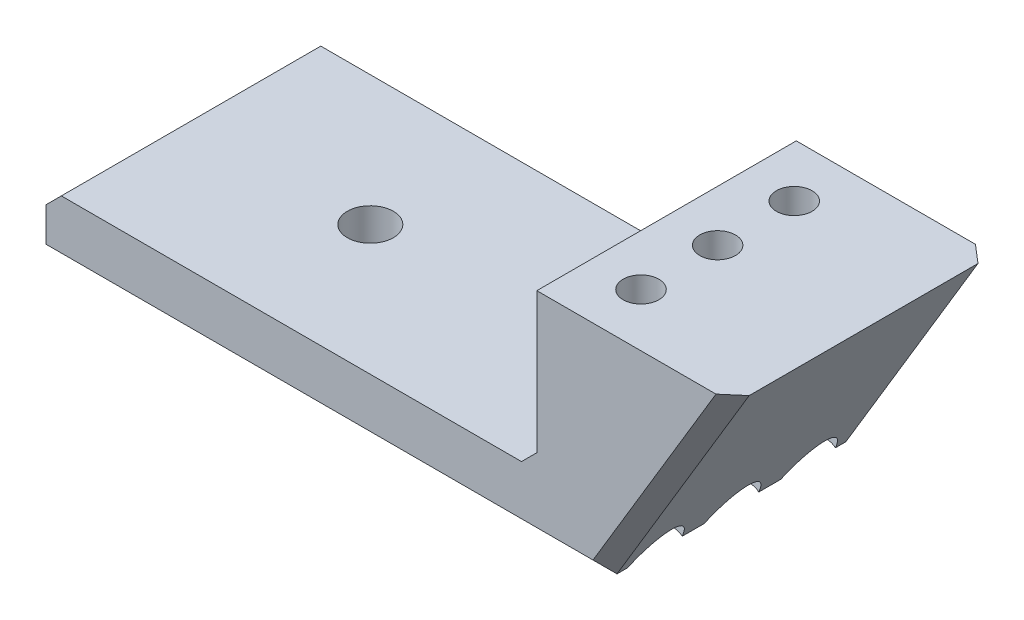
ISO-10303-21;
HEADER;
FILE_DESCRIPTION(('STEP AP214'),'2;1');
FILE_NAME('part.step','',(''),(''),'','','');
FILE_SCHEMA(('AUTOMOTIVE_DESIGN { 1 0 10303 214 1 1 1 1 }'));
ENDSEC;
DATA;
#1=APPLICATION_CONTEXT('core data for automotive mechanical design processes');
#2=APPLICATION_PROTOCOL_DEFINITION('international standard','automotive_design',2000,#1);
#3=PRODUCT_CONTEXT('',#1,'mechanical');
#4=PRODUCT('Part','Part','',(#3));
#5=PRODUCT_RELATED_PRODUCT_CATEGORY('part','',(#4));
#6=PRODUCT_DEFINITION_FORMATION('','',#4);
#7=PRODUCT_DEFINITION_CONTEXT('part definition',#1,'design');
#8=PRODUCT_DEFINITION('design','',#6,#7);
#9=PRODUCT_DEFINITION_SHAPE('','',#8);
#10=(LENGTH_UNIT() NAMED_UNIT(*) SI_UNIT(.MILLI.,.METRE.));
#11=(NAMED_UNIT(*) PLANE_ANGLE_UNIT() SI_UNIT($,.RADIAN.));
#12=(NAMED_UNIT(*) SI_UNIT($,.STERADIAN.) SOLID_ANGLE_UNIT());
#13=UNCERTAINTY_MEASURE_WITH_UNIT(LENGTH_MEASURE(1.E-05),#10,'distance_accuracy_value','');
#14=(GEOMETRIC_REPRESENTATION_CONTEXT(3) GLOBAL_UNCERTAINTY_ASSIGNED_CONTEXT((#13)) GLOBAL_UNIT_ASSIGNED_CONTEXT((#10,
#11,#12)) REPRESENTATION_CONTEXT('',''));
#15=CARTESIAN_POINT('',(0.,0.,0.));
#16=DIRECTION('',(0.,0.,1.));
#17=DIRECTION('',(1.,0.,0.));
#18=AXIS2_PLACEMENT_3D('',#15,#16,#17);
#19=CARTESIAN_POINT('',(5.00000000000001,-21.59,5.2));
#20=DIRECTION('',(0.,-1.,0.));
#21=DIRECTION('',(0.,0.,-1.));
#22=AXIS2_PLACEMENT_3D('',#19,#20,#21);
#23=CYLINDRICAL_SURFACE('',#22,1.75);
#24=CARTESIAN_POINT('',(5.00000000000001,0.,5.2));
#25=DIRECTION('',(0.,-1.,0.));
#26=DIRECTION('',(0.,0.,-1.));
#27=AXIS2_PLACEMENT_3D('',#24,#25,#26);
#28=CIRCLE('',#27,1.74999999999999);
#29=CARTESIAN_POINT('',(5.00000000000001,0.,3.45000000000001));
#30=VERTEX_POINT('',#29);
#31=EDGE_CURVE('E208',#30,#30,#28,.T.);
#32=ORIENTED_EDGE('',*,*,#31,.F.);
#33=EDGE_LOOP('',(#32));
#34=FACE_BOUND('',#33,.T.);
#35=CARTESIAN_POINT('',(5.00000000000001,-11.47,5.2));
#36=DIRECTION('',(0.,-1.,0.));
#37=DIRECTION('',(0.,0.,-1.));
#38=AXIS2_PLACEMENT_3D('',#35,#36,#37);
#39=CIRCLE('',#38,1.75);
#40=CARTESIAN_POINT('',(5.00000000000001,-11.47,3.45));
#41=VERTEX_POINT('',#40);
#42=EDGE_CURVE('E11',#41,#41,#39,.F.);
#43=ORIENTED_EDGE('',*,*,#42,.F.);
#44=EDGE_LOOP('',(#43));
#45=FACE_BOUND('',#44,.T.);
#46=ADVANCED_FACE('F41',(#34,#45),#23,.F.);
#47=CARTESIAN_POINT('',(5.00000000000001,-21.59,12.7));
#48=DIRECTION('',(0.,-1.,0.));
#49=DIRECTION('',(0.,0.,-1.));
#50=AXIS2_PLACEMENT_3D('',#47,#48,#49);
#51=CYLINDRICAL_SURFACE('',#50,1.75);
#52=CARTESIAN_POINT('',(5.00000000000001,0.,12.7));
#53=DIRECTION('',(0.,-1.,0.));
#54=DIRECTION('',(0.,0.,-1.));
#55=AXIS2_PLACEMENT_3D('',#52,#53,#54);
#56=CIRCLE('',#55,1.74999999999999);
#57=CARTESIAN_POINT('',(5.00000000000001,0.,10.95));
#58=VERTEX_POINT('',#57);
#59=EDGE_CURVE('E191',#58,#58,#56,.T.);
#60=ORIENTED_EDGE('',*,*,#59,.F.);
#61=EDGE_LOOP('',(#60));
#62=FACE_BOUND('',#61,.T.);
#63=CARTESIAN_POINT('',(5.00000000000001,-11.47,12.7));
#64=DIRECTION('',(0.,-1.,0.));
#65=DIRECTION('',(0.,0.,-1.));
#66=AXIS2_PLACEMENT_3D('',#63,#64,#65);
#67=CIRCLE('',#66,1.75);
#68=CARTESIAN_POINT('',(5.00000000000001,-11.47,10.95));
#69=VERTEX_POINT('',#68);
#70=EDGE_CURVE('E51',#69,#69,#67,.F.);
#71=ORIENTED_EDGE('',*,*,#70,.F.);
#72=EDGE_LOOP('',(#71));
#73=FACE_BOUND('',#72,.T.);
#74=ADVANCED_FACE('F327',(#62,#73),#51,.F.);
#75=CARTESIAN_POINT('',(5.00000000000001,-21.59,20.2));
#76=DIRECTION('',(0.,-1.,0.));
#77=DIRECTION('',(0.,0.,-1.));
#78=AXIS2_PLACEMENT_3D('',#75,#76,#77);
#79=CYLINDRICAL_SURFACE('',#78,1.75);
#80=CARTESIAN_POINT('',(5.00000000000001,0.,20.2));
#81=DIRECTION('',(0.,-1.,0.));
#82=DIRECTION('',(0.,0.,-1.));
#83=AXIS2_PLACEMENT_3D('',#80,#81,#82);
#84=CIRCLE('',#83,1.74999999999999);
#85=CARTESIAN_POINT('',(5.00000000000001,0.,18.45));
#86=VERTEX_POINT('',#85);
#87=EDGE_CURVE('E176',#86,#86,#84,.T.);
#88=ORIENTED_EDGE('',*,*,#87,.F.);
#89=EDGE_LOOP('',(#88));
#90=FACE_BOUND('',#89,.T.);
#91=CARTESIAN_POINT('',(5.00000000000001,-11.47,20.2));
#92=DIRECTION('',(0.,-1.,0.));
#93=DIRECTION('',(0.,0.,-1.));
#94=AXIS2_PLACEMENT_3D('',#91,#92,#93);
#95=CIRCLE('',#94,1.75);
#96=CARTESIAN_POINT('',(5.00000000000001,-11.47,18.45));
#97=VERTEX_POINT('',#96);
#98=EDGE_CURVE('E314',#97,#97,#95,.F.);
#99=ORIENTED_EDGE('',*,*,#98,.F.);
#100=EDGE_LOOP('',(#99));
#101=FACE_BOUND('',#100,.T.);
#102=ADVANCED_FACE('F329',(#90,#101),#79,.F.);
#103=CARTESIAN_POINT('',(6.35,-21.59,25.4));
#104=DIRECTION('',(0.,1.,0.));
#105=DIRECTION('',(-1.,0.,0.));
#106=AXIS2_PLACEMENT_3D('',#103,#104,#105);
#107=PLANE('',#106);
#108=CARTESIAN_POINT('',(-29.,-21.59,12.7));
#109=DIRECTION('',(0.,-1.,0.));
#110=DIRECTION('',(0.,0.,-1.));
#111=AXIS2_PLACEMENT_3D('',#108,#109,#110);
#112=CIRCLE('',#111,2.25);
#113=CARTESIAN_POINT('',(-29.,-21.59,10.45));
#114=VERTEX_POINT('',#113);
#115=EDGE_CURVE('E663',#114,#114,#112,.T.);
#116=ORIENTED_EDGE('',*,*,#115,.F.);
#117=EDGE_LOOP('',(#116));
#118=FACE_BOUND('',#117,.T.);
#119=DIRECTION('',(0.,0.,-1.));
#120=VECTOR('',#119,1.);
#121=CARTESIAN_POINT('',(-48.05,-21.59,25.4));
#122=LINE('',#121,#120);
#123=CARTESIAN_POINT('',(-48.05,-21.59,23.9));
#124=VERTEX_POINT('',#123);
#125=CARTESIAN_POINT('',(-48.05,-21.59,1.49999999999999));
#126=VERTEX_POINT('',#125);
#127=EDGE_CURVE('E155',#124,#126,#122,.T.);
#128=ORIENTED_EDGE('',*,*,#127,.T.);
#129=DIRECTION('',(1.,0.,0.));
#130=VECTOR('',#129,1.);
#131=CARTESIAN_POINT('',(6.35,-21.59,1.49999999999999));
#132=LINE('',#131,#130);
#133=CARTESIAN_POINT('',(6.35,-21.59,1.49999999999999));
#134=VERTEX_POINT('',#133);
#135=EDGE_CURVE('E296',#126,#134,#132,.T.);
#136=ORIENTED_EDGE('',*,*,#135,.T.);
#137=DIRECTION('',(0.,0.,-1.));
#138=VECTOR('',#137,1.);
#139=CARTESIAN_POINT('',(6.35,-21.59,25.4));
#140=LINE('',#139,#138);
#141=CARTESIAN_POINT('',(6.35,-21.59,2.52091433507623));
#142=VERTEX_POINT('',#141);
#143=EDGE_CURVE('E158',#142,#134,#140,.T.);
#144=ORIENTED_EDGE('',*,*,#143,.F.);
#145=CARTESIAN_POINT('',(5.00000000000001,-21.59,5.2));
#146=DIRECTION('',(0.,-1.,0.));
#147=DIRECTION('',(0.,0.,-1.));
#148=AXIS2_PLACEMENT_3D('',#145,#146,#147);
#149=CIRCLE('',#148,3.);
#150=CARTESIAN_POINT('',(6.35,-21.59,7.87908566492376));
#151=VERTEX_POINT('',#150);
#152=EDGE_CURVE('E200',#151,#142,#149,.T.);
#153=ORIENTED_EDGE('',*,*,#152,.F.);
#154=CARTESIAN_POINT('',(6.35,-21.59,10.0209143350762));
#155=VERTEX_POINT('',#154);
#156=EDGE_CURVE('E441',#155,#151,#140,.T.);
#157=ORIENTED_EDGE('',*,*,#156,.F.);
#158=CARTESIAN_POINT('',(5.00000000000001,-21.59,12.7));
#159=DIRECTION('',(0.,1.,0.));
#160=DIRECTION('',(-1.,0.,0.));
#161=AXIS2_PLACEMENT_3D('',#158,#159,#160);
#162=CIRCLE('',#161,3.);
#163=CARTESIAN_POINT('',(6.35,-21.59,15.3790856649238));
#164=VERTEX_POINT('',#163);
#165=EDGE_CURVE('E164',#155,#164,#162,.T.);
#166=ORIENTED_EDGE('',*,*,#165,.T.);
#167=CARTESIAN_POINT('',(6.35,-21.59,17.5209143350762));
#168=VERTEX_POINT('',#167);
#169=EDGE_CURVE('E156',#168,#164,#140,.T.);
#170=ORIENTED_EDGE('',*,*,#169,.F.);
#171=CARTESIAN_POINT('',(5.00000000000001,-21.59,20.2));
#172=DIRECTION('',(0.,-1.,0.));
#173=DIRECTION('',(0.,0.,-1.));
#174=AXIS2_PLACEMENT_3D('',#171,#172,#173);
#175=CIRCLE('',#174,3.);
#176=CARTESIAN_POINT('',(6.35,-21.59,22.8790856649238));
#177=VERTEX_POINT('',#176);
#178=EDGE_CURVE('E161',#177,#168,#175,.T.);
#179=ORIENTED_EDGE('',*,*,#178,.F.);
#180=CARTESIAN_POINT('',(6.35,-21.59,23.9));
#181=VERTEX_POINT('',#180);
#182=EDGE_CURVE('E144',#181,#177,#140,.T.);
#183=ORIENTED_EDGE('',*,*,#182,.F.);
#184=DIRECTION('',(-1.,0.,0.));
#185=VECTOR('',#184,1.);
#186=CARTESIAN_POINT('',(-48.05,-21.59,23.9));
#187=LINE('',#186,#185);
#188=EDGE_CURVE('E293',#181,#124,#187,.T.);
#189=ORIENTED_EDGE('',*,*,#188,.T.);
#190=EDGE_LOOP('',(#128,#136,#144,#153,#157,#166,#170,#179,#183,#189));
#191=FACE_BOUND('',#190,.T.);
#192=ADVANCED_FACE('F167',(#118,#191),#107,.F.);
#193=CARTESIAN_POINT('',(0.,0.,25.4));
#194=DIRECTION('',(1.,0.,0.));
#195=DIRECTION('',(0.,1.,0.));
#196=AXIS2_PLACEMENT_3D('',#193,#194,#195);
#197=PLANE('',#196);
#198=DIRECTION('',(0.,-1.,0.));
#199=VECTOR('',#198,1.);
#200=CARTESIAN_POINT('',(0.,0.,0.));
#201=LINE('',#200,#199);
#202=CARTESIAN_POINT('',(0.,0.,0.));
#203=VERTEX_POINT('',#202);
#204=CARTESIAN_POINT('',(0.,-13.74,0.));
#205=VERTEX_POINT('',#204);
#206=EDGE_CURVE('E212',#203,#205,#201,.T.);
#207=ORIENTED_EDGE('',*,*,#206,.T.);
#208=DIRECTION('',(0.,0.,1.));
#209=VECTOR('',#208,1.);
#210=CARTESIAN_POINT('',(0.,-13.74,25.4));
#211=LINE('',#210,#209);
#212=CARTESIAN_POINT('',(0.,-13.74,25.4));
#213=VERTEX_POINT('',#212);
#214=EDGE_CURVE('E290',#205,#213,#211,.T.);
#215=ORIENTED_EDGE('',*,*,#214,.T.);
#216=DIRECTION('',(0.,-1.,0.));
#217=VECTOR('',#216,1.);
#218=CARTESIAN_POINT('',(0.,0.,25.4));
#219=LINE('',#218,#217);
#220=CARTESIAN_POINT('',(0.,0.,25.4));
#221=VERTEX_POINT('',#220);
#222=EDGE_CURVE('E216',#221,#213,#219,.T.);
#223=ORIENTED_EDGE('',*,*,#222,.F.);
#224=DIRECTION('',(0.,0.,-1.));
#225=VECTOR('',#224,1.);
#226=CARTESIAN_POINT('',(0.,0.,25.4));
#227=LINE('',#226,#225);
#228=EDGE_CURVE('E204',#221,#203,#227,.T.);
#229=ORIENTED_EDGE('',*,*,#228,.T.);
#230=EDGE_LOOP('',(#207,#215,#223,#229));
#231=FACE_BOUND('',#230,.T.);
#232=ADVANCED_FACE('F371',(#231),#197,.F.);
#233=CARTESIAN_POINT('',(0.,-15.24,25.4));
#234=DIRECTION('',(0.,-1.,0.));
#235=DIRECTION('',(1.,0.,0.));
#236=AXIS2_PLACEMENT_3D('',#233,#234,#235);
#237=PLANE('',#236);
#238=CARTESIAN_POINT('',(-29.,-15.24,12.7));
#239=DIRECTION('',(0.,-1.,0.));
#240=DIRECTION('',(1.,0.,0.));
#241=AXIS2_PLACEMENT_3D('',#238,#239,#240);
#242=CIRCLE('',#241,2.25);
#243=CARTESIAN_POINT('',(-26.75,-15.24,12.7));
#244=VERTEX_POINT('',#243);
#245=EDGE_CURVE('E181',#244,#244,#242,.F.);
#246=ORIENTED_EDGE('',*,*,#245,.F.);
#247=EDGE_LOOP('',(#246));
#248=FACE_BOUND('',#247,.T.);
#249=DIRECTION('',(-1.,0.,0.));
#250=VECTOR('',#249,1.);
#251=CARTESIAN_POINT('',(0.,-15.24,0.));
#252=LINE('',#251,#250);
#253=CARTESIAN_POINT('',(-1.50000000000001,-15.24,0.));
#254=VERTEX_POINT('',#253);
#255=CARTESIAN_POINT('',(-46.55,-15.24,0.));
#256=VERTEX_POINT('',#255);
#257=EDGE_CURVE('E233',#254,#256,#252,.T.);
#258=ORIENTED_EDGE('',*,*,#257,.T.);
#259=DIRECTION('',(0.,0.,1.));
#260=VECTOR('',#259,1.);
#261=CARTESIAN_POINT('',(-46.55,-15.24,25.4));
#262=LINE('',#261,#260);
#263=CARTESIAN_POINT('',(-46.55,-15.24,25.4));
#264=VERTEX_POINT('',#263);
#265=EDGE_CURVE('E277',#256,#264,#262,.T.);
#266=ORIENTED_EDGE('',*,*,#265,.T.);
#267=DIRECTION('',(-1.,0.,0.));
#268=VECTOR('',#267,1.);
#269=CARTESIAN_POINT('',(0.,-15.24,25.4));
#270=LINE('',#269,#268);
#271=CARTESIAN_POINT('',(-1.50000000000001,-15.24,25.4));
#272=VERTEX_POINT('',#271);
#273=EDGE_CURVE('E221',#272,#264,#270,.T.);
#274=ORIENTED_EDGE('',*,*,#273,.F.);
#275=DIRECTION('',(0.,0.,-1.));
#276=VECTOR('',#275,1.);
#277=CARTESIAN_POINT('',(-1.50000000000001,-15.24,0.));
#278=LINE('',#277,#276);
#279=EDGE_CURVE('E273',#272,#254,#278,.T.);
#280=ORIENTED_EDGE('',*,*,#279,.T.);
#281=EDGE_LOOP('',(#258,#266,#274,#280));
#282=FACE_BOUND('',#281,.T.);
#283=ADVANCED_FACE('F375',(#248,#282),#237,.F.);
#284=CARTESIAN_POINT('',(-48.05,-15.24,25.4));
#285=DIRECTION('',(1.,0.,0.));
#286=DIRECTION('',(0.,0.,-1.));
#287=AXIS2_PLACEMENT_3D('',#284,#285,#286);
#288=PLANE('',#287);
#289=DIRECTION('',(0.,-1.,0.));
#290=VECTOR('',#289,1.);
#291=CARTESIAN_POINT('',(-48.05,-15.24,25.4));
#292=LINE('',#291,#290);
#293=CARTESIAN_POINT('',(-48.05,-16.74,25.4));
#294=VERTEX_POINT('',#293);
#295=CARTESIAN_POINT('',(-48.05,-20.09,25.4));
#296=VERTEX_POINT('',#295);
#297=EDGE_CURVE('E225',#294,#296,#292,.T.);
#298=ORIENTED_EDGE('',*,*,#297,.F.);
#299=DIRECTION('',(0.,0.,-1.));
#300=VECTOR('',#299,1.);
#301=CARTESIAN_POINT('',(-48.05,-16.74,25.4));
#302=LINE('',#301,#300);
#303=CARTESIAN_POINT('',(-48.05,-16.74,0.));
#304=VERTEX_POINT('',#303);
#305=EDGE_CURVE('E260',#294,#304,#302,.T.);
#306=ORIENTED_EDGE('',*,*,#305,.T.);
#307=DIRECTION('',(0.,-1.,0.));
#308=VECTOR('',#307,1.);
#309=CARTESIAN_POINT('',(-48.05,-15.24,0.));
#310=LINE('',#309,#308);
#311=CARTESIAN_POINT('',(-48.05,-20.09,0.));
#312=VERTEX_POINT('',#311);
#313=EDGE_CURVE('E237',#304,#312,#310,.T.);
#314=ORIENTED_EDGE('',*,*,#313,.T.);
#315=DIRECTION('',(0.,0.707106781186549,-0.707106781186546));
#316=VECTOR('',#315,1.);
#317=CARTESIAN_POINT('',(-48.05,-21.59,1.49999999999998));
#318=LINE('',#317,#316);
#319=EDGE_CURVE('E257',#312,#126,#318,.F.);
#320=ORIENTED_EDGE('',*,*,#319,.T.);
#321=ORIENTED_EDGE('',*,*,#127,.F.);
#322=DIRECTION('',(0.,0.707106781186545,0.707106781186551));
#323=VECTOR('',#322,1.);
#324=CARTESIAN_POINT('',(-48.05,-20.09,25.4));
#325=LINE('',#324,#323);
#326=EDGE_CURVE('E163',#124,#296,#325,.T.);
#327=ORIENTED_EDGE('',*,*,#326,.T.);
#328=EDGE_LOOP('',(#298,#306,#314,#320,#321,#327));
#329=FACE_BOUND('',#328,.T.);
#330=ADVANCED_FACE('F368',(#329),#288,.F.);
#331=CARTESIAN_POINT('',(6.35,-21.59,25.4));
#332=DIRECTION('',(-0.857738210067941,0.514086727108807,0.));
#333=DIRECTION('',(-0.514086727108807,-0.857738210067941,0.));
#334=AXIS2_PLACEMENT_3D('',#331,#332,#333);
#335=PLANE('',#334);
#336=ORIENTED_EDGE('',*,*,#143,.T.);
#337=DIRECTION('',(0.514086727108807,0.857738210067941,0.));
#338=VECTOR('',#337,1.);
#339=CARTESIAN_POINT('',(6.35,-21.59,1.49999999999999));
#340=LINE('',#339,#338);
#341=CARTESIAN_POINT('',(19.29,0.,1.49999999999999));
#342=VERTEX_POINT('',#341);
#343=EDGE_CURVE('E58',#134,#342,#340,.T.);
#344=ORIENTED_EDGE('',*,*,#343,.T.);
#345=DIRECTION('',(0.,0.,-1.));
#346=VECTOR('',#345,1.);
#347=CARTESIAN_POINT('',(19.29,0.,25.4));
#348=LINE('',#347,#346);
#349=CARTESIAN_POINT('',(19.29,0.,23.9));
#350=VERTEX_POINT('',#349);
#351=EDGE_CURVE('E229',#350,#342,#348,.T.);
#352=ORIENTED_EDGE('',*,*,#351,.F.);
#353=DIRECTION('',(-0.514086727108807,-0.857738210067941,0.));
#354=VECTOR('',#353,1.);
#355=CARTESIAN_POINT('',(6.35,-21.59,23.9));
#356=LINE('',#355,#354);
#357=EDGE_CURVE('E150',#350,#181,#356,.T.);
#358=ORIENTED_EDGE('',*,*,#357,.T.);
#359=ORIENTED_EDGE('',*,*,#182,.T.);
#360=CARTESIAN_POINT('',(5.00000000000001,-23.8424343122102,20.2));
#361=DIRECTION('',(-0.857738210067941,0.514086727108807,0.));
#362=DIRECTION('',(-0.514086727108807,-0.857738210067941,0.));
#363=AXIS2_PLACEMENT_3D('',#360,#361,#362);
#364=ELLIPSE('',#363,5.83559123743929,3.);
#365=EDGE_CURVE('E147',#177,#168,#364,.T.);
#366=ORIENTED_EDGE('',*,*,#365,.T.);
#367=ORIENTED_EDGE('',*,*,#169,.T.);
#368=CARTESIAN_POINT('',(5.00000000000001,-23.8424343122102,12.7));
#369=DIRECTION('',(-0.857738210067941,0.514086727108807,0.));
#370=DIRECTION('',(-0.514086727108807,-0.857738210067941,0.));
#371=AXIS2_PLACEMENT_3D('',#368,#369,#370);
#372=ELLIPSE('',#371,5.83559123743929,3.);
#373=EDGE_CURVE('E195',#164,#155,#372,.T.);
#374=ORIENTED_EDGE('',*,*,#373,.T.);
#375=ORIENTED_EDGE('',*,*,#156,.T.);
#376=CARTESIAN_POINT('',(5.00000000000001,-23.8424343122102,5.2));
#377=DIRECTION('',(-0.857738210067941,0.514086727108807,0.));
#378=DIRECTION('',(-0.514086727108807,-0.857738210067941,0.));
#379=AXIS2_PLACEMENT_3D('',#376,#377,#378);
#380=ELLIPSE('',#379,5.83559123743929,3.);
#381=EDGE_CURVE('E203',#151,#142,#380,.T.);
#382=ORIENTED_EDGE('',*,*,#381,.T.);
#383=EDGE_LOOP('',(#336,#344,#352,#358,#359,#366,#367,#374,#375,#382));
#384=FACE_BOUND('',#383,.T.);
#385=ADVANCED_FACE('F146',(#384),#335,.F.);
#386=CARTESIAN_POINT('',(6.35,0.,25.4));
#387=DIRECTION('',(0.,-1.,0.));
#388=DIRECTION('',(1.,0.,0.));
#389=AXIS2_PLACEMENT_3D('',#386,#387,#388);
#390=PLANE('',#389);
#391=ORIENTED_EDGE('',*,*,#87,.T.);
#392=EDGE_LOOP('',(#391));
#393=FACE_BOUND('',#392,.T.);
#394=ORIENTED_EDGE('',*,*,#59,.T.);
#395=EDGE_LOOP('',(#394));
#396=FACE_BOUND('',#395,.T.);
#397=ORIENTED_EDGE('',*,*,#31,.T.);
#398=EDGE_LOOP('',(#397));
#399=FACE_BOUND('',#398,.T.);
#400=ORIENTED_EDGE('',*,*,#351,.T.);
#401=DIRECTION('',(0.759033269529304,0.,0.651051837988078));
#402=VECTOR('',#401,1.);
#403=CARTESIAN_POINT('',(11.8348583349747,0.,-4.89455986756174));
#404=LINE('',#403,#402);
#405=CARTESIAN_POINT('',(17.5412146685395,0.,0.));
#406=VERTEX_POINT('',#405);
#407=EDGE_CURVE('E306',#342,#406,#404,.F.);
#408=ORIENTED_EDGE('',*,*,#407,.T.);
#409=DIRECTION('',(-1.,0.,0.));
#410=VECTOR('',#409,1.);
#411=CARTESIAN_POINT('',(6.35,0.,0.));
#412=LINE('',#411,#410);
#413=EDGE_CURVE('E217',#406,#203,#412,.T.);
#414=ORIENTED_EDGE('',*,*,#413,.T.);
#415=ORIENTED_EDGE('',*,*,#228,.F.);
#416=DIRECTION('',(-1.,0.,0.));
#417=VECTOR('',#416,1.);
#418=CARTESIAN_POINT('',(6.35,0.,25.4));
#419=LINE('',#418,#417);
#420=CARTESIAN_POINT('',(17.5412146685395,0.,25.4));
#421=VERTEX_POINT('',#420);
#422=EDGE_CURVE('E213',#421,#221,#419,.T.);
#423=ORIENTED_EDGE('',*,*,#422,.F.);
#424=DIRECTION('',(0.7590332695293,0.,-0.651051837988083));
#425=VECTOR('',#424,1.);
#426=CARTESIAN_POINT('',(14.8703365502812,0.,27.6909142164645));
#427=LINE('',#426,#425);
#428=EDGE_CURVE('E65',#421,#350,#427,.T.);
#429=ORIENTED_EDGE('',*,*,#428,.T.);
#430=EDGE_LOOP('',(#400,#408,#414,#415,#423,#429));
#431=FACE_BOUND('',#430,.T.);
#432=ADVANCED_FACE('F358',(#393,#396,#399,#431),#390,.F.);
#433=CARTESIAN_POINT('',(0.,0.,25.4));
#434=DIRECTION('',(0.,0.,1.));
#435=DIRECTION('',(1.,0.,0.));
#436=AXIS2_PLACEMENT_3D('',#433,#434,#435);
#437=PLANE('',#436);
#438=ORIENTED_EDGE('',*,*,#273,.T.);
#439=DIRECTION('',(0.707106781186551,0.707106781186544,0.));
#440=VECTOR('',#439,1.);
#441=CARTESIAN_POINT('',(-15.6549999999998,15.6549999999999,25.4));
#442=LINE('',#441,#440);
#443=EDGE_CURVE('E287',#264,#294,#442,.F.);
#444=ORIENTED_EDGE('',*,*,#443,.T.);
#445=ORIENTED_EDGE('',*,*,#297,.T.);
#446=DIRECTION('',(1.,0.,0.));
#447=VECTOR('',#446,1.);
#448=CARTESIAN_POINT('',(6.35,-20.09,25.4));
#449=LINE('',#448,#447);
#450=CARTESIAN_POINT('',(5.50024199600592,-20.09,25.4));
#451=VERTEX_POINT('',#450);
#452=EDGE_CURVE('E280',#296,#451,#449,.T.);
#453=ORIENTED_EDGE('',*,*,#452,.T.);
#454=DIRECTION('',(0.514086727108807,0.857738210067941,0.));
#455=VECTOR('',#454,1.);
#456=CARTESIAN_POINT('',(18.0033926848981,0.771130090663216,25.4));
#457=LINE('',#456,#455);
#458=EDGE_CURVE('E283',#451,#421,#457,.T.);
#459=ORIENTED_EDGE('',*,*,#458,.T.);
#460=ORIENTED_EDGE('',*,*,#422,.T.);
#461=ORIENTED_EDGE('',*,*,#222,.T.);
#462=DIRECTION('',(0.707106781186551,0.707106781186544,0.));
#463=VECTOR('',#462,1.);
#464=CARTESIAN_POINT('',(-1.50000000000001,-15.24,25.4));
#465=LINE('',#464,#463);
#466=EDGE_CURVE('E312',#213,#272,#465,.F.);
#467=ORIENTED_EDGE('',*,*,#466,.T.);
#468=EDGE_LOOP('',(#438,#444,#445,#453,#459,#460,#461,#467));
#469=FACE_BOUND('',#468,.T.);
#470=ADVANCED_FACE('F355',(#469),#437,.T.);
#471=CARTESIAN_POINT('',(0.,0.,0.));
#472=DIRECTION('',(0.,0.,1.));
#473=DIRECTION('',(1.,0.,0.));
#474=AXIS2_PLACEMENT_3D('',#471,#472,#473);
#475=PLANE('',#474);
#476=ORIENTED_EDGE('',*,*,#313,.F.);
#477=DIRECTION('',(-0.707106781186551,-0.707106781186544,0.));
#478=VECTOR('',#477,1.);
#479=CARTESIAN_POINT('',(-48.05,-16.74,0.));
#480=LINE('',#479,#478);
#481=EDGE_CURVE('E270',#304,#256,#480,.F.);
#482=ORIENTED_EDGE('',*,*,#481,.T.);
#483=ORIENTED_EDGE('',*,*,#257,.F.);
#484=DIRECTION('',(-0.707106781186551,-0.707106781186544,0.));
#485=VECTOR('',#484,1.);
#486=CARTESIAN_POINT('',(6.87,-6.87000000000006,0.));
#487=LINE('',#486,#485);
#488=EDGE_CURVE('E309',#254,#205,#487,.F.);
#489=ORIENTED_EDGE('',*,*,#488,.T.);
#490=ORIENTED_EDGE('',*,*,#206,.F.);
#491=ORIENTED_EDGE('',*,*,#413,.F.);
#492=DIRECTION('',(-0.514086727108807,-0.857738210067941,0.));
#493=VECTOR('',#492,1.);
#494=CARTESIAN_POINT('',(12.9053318908317,-7.73483069325438,0.));
#495=LINE('',#494,#493);
#496=CARTESIAN_POINT('',(5.50024199600592,-20.09,0.));
#497=VERTEX_POINT('',#496);
#498=EDGE_CURVE('E264',#406,#497,#495,.T.);
#499=ORIENTED_EDGE('',*,*,#498,.T.);
#500=DIRECTION('',(-1.,0.,0.));
#501=VECTOR('',#500,1.);
#502=CARTESIAN_POINT('',(0.,-20.09,0.));
#503=LINE('',#502,#501);
#504=EDGE_CURVE('E267',#497,#312,#503,.T.);
#505=ORIENTED_EDGE('',*,*,#504,.T.);
#506=EDGE_LOOP('',(#476,#482,#483,#489,#490,#491,#499,#505));
#507=FACE_BOUND('',#506,.T.);
#508=ADVANCED_FACE('F349',(#507),#475,.F.);
#509=CARTESIAN_POINT('',(5.00000000000001,-21.59,5.2));
#510=DIRECTION('',(0.,-1.,0.));
#511=DIRECTION('',(0.,0.,-1.));
#512=AXIS2_PLACEMENT_3D('',#509,#510,#511);
#513=CYLINDRICAL_SURFACE('',#512,3.);
#514=CARTESIAN_POINT('',(5.00000000000001,-11.59,5.2));
#515=DIRECTION('',(0.,-1.,0.));
#516=DIRECTION('',(0.,0.,-1.));
#517=AXIS2_PLACEMENT_3D('',#514,#515,#516);
#518=CIRCLE('',#517,3.);
#519=CARTESIAN_POINT('',(5.00000000000001,-11.59,2.2));
#520=VERTEX_POINT('',#519);
#521=EDGE_CURVE('E199',#520,#520,#518,.T.);
#522=ORIENTED_EDGE('',*,*,#521,.F.);
#523=EDGE_LOOP('',(#522));
#524=FACE_BOUND('',#523,.T.);
#525=ORIENTED_EDGE('',*,*,#152,.T.);
#526=ORIENTED_EDGE('',*,*,#381,.F.);
#527=EDGE_LOOP('',(#525,#526));
#528=FACE_BOUND('',#527,.T.);
#529=ADVANCED_FACE('F345',(#524,#528),#513,.F.);
#530=CARTESIAN_POINT('',(6.75000000000001,-11.59,5.2));
#531=DIRECTION('',(0.,1.,0.));
#532=DIRECTION('',(0.,0.,1.));
#533=AXIS2_PLACEMENT_3D('',#530,#531,#532);
#534=PLANE('',#533);
#535=ORIENTED_EDGE('',*,*,#521,.T.);
#536=EDGE_LOOP('',(#535));
#537=FACE_BOUND('',#536,.T.);
#538=ADVANCED_FACE('F348',(#537),#534,.F.);
#539=CARTESIAN_POINT('',(5.00000000000001,-21.59,12.7));
#540=DIRECTION('',(0.,-1.,0.));
#541=DIRECTION('',(0.,0.,-1.));
#542=AXIS2_PLACEMENT_3D('',#539,#540,#541);
#543=CYLINDRICAL_SURFACE('',#542,3.);
#544=CARTESIAN_POINT('',(5.00000000000001,-11.59,12.7));
#545=DIRECTION('',(0.,-1.,0.));
#546=DIRECTION('',(0.,0.,-1.));
#547=AXIS2_PLACEMENT_3D('',#544,#545,#546);
#548=CIRCLE('',#547,3.);
#549=CARTESIAN_POINT('',(5.00000000000001,-11.59,9.7));
#550=VERTEX_POINT('',#549);
#551=EDGE_CURVE('E187',#550,#550,#548,.T.);
#552=ORIENTED_EDGE('',*,*,#551,.F.);
#553=EDGE_LOOP('',(#552));
#554=FACE_BOUND('',#553,.T.);
#555=ORIENTED_EDGE('',*,*,#165,.F.);
#556=ORIENTED_EDGE('',*,*,#373,.F.);
#557=EDGE_LOOP('',(#555,#556));
#558=FACE_BOUND('',#557,.T.);
#559=ADVANCED_FACE('F352',(#554,#558),#543,.F.);
#560=CARTESIAN_POINT('',(6.75000000000001,-11.59,12.7));
#561=DIRECTION('',(0.,1.,0.));
#562=DIRECTION('',(0.,0.,1.));
#563=AXIS2_PLACEMENT_3D('',#560,#561,#562);
#564=PLANE('',#563);
#565=ORIENTED_EDGE('',*,*,#551,.T.);
#566=EDGE_LOOP('',(#565));
#567=FACE_BOUND('',#566,.T.);
#568=ADVANCED_FACE('F343',(#567),#564,.F.);
#569=CARTESIAN_POINT('',(5.00000000000001,-21.59,20.2));
#570=DIRECTION('',(0.,-1.,0.));
#571=DIRECTION('',(0.,0.,-1.));
#572=AXIS2_PLACEMENT_3D('',#569,#570,#571);
#573=CYLINDRICAL_SURFACE('',#572,3.);
#574=CARTESIAN_POINT('',(5.00000000000001,-11.59,20.2));
#575=DIRECTION('',(0.,-1.,0.));
#576=DIRECTION('',(0.,0.,-1.));
#577=AXIS2_PLACEMENT_3D('',#574,#575,#576);
#578=CIRCLE('',#577,3.);
#579=CARTESIAN_POINT('',(5.00000000000001,-11.59,17.2));
#580=VERTEX_POINT('',#579);
#581=EDGE_CURVE('E170',#580,#580,#578,.T.);
#582=ORIENTED_EDGE('',*,*,#581,.F.);
#583=EDGE_LOOP('',(#582));
#584=FACE_BOUND('',#583,.T.);
#585=ORIENTED_EDGE('',*,*,#178,.T.);
#586=ORIENTED_EDGE('',*,*,#365,.F.);
#587=EDGE_LOOP('',(#585,#586));
#588=FACE_BOUND('',#587,.T.);
#589=ADVANCED_FACE('F160',(#584,#588),#573,.F.);
#590=CARTESIAN_POINT('',(6.75000000000001,-11.59,20.2));
#591=DIRECTION('',(0.,1.,0.));
#592=DIRECTION('',(0.,0.,1.));
#593=AXIS2_PLACEMENT_3D('',#590,#591,#592);
#594=PLANE('',#593);
#595=ORIENTED_EDGE('',*,*,#581,.T.);
#596=EDGE_LOOP('',(#595));
#597=FACE_BOUND('',#596,.T.);
#598=ADVANCED_FACE('F391',(#597),#594,.F.);
#599=CARTESIAN_POINT('',(-48.05,-16.74,25.4));
#600=DIRECTION('',(0.707106781186544,-0.707106781186551,0.));
#601=DIRECTION('',(0.,0.,-1.));
#602=AXIS2_PLACEMENT_3D('',#599,#600,#601);
#603=PLANE('',#602);
#604=ORIENTED_EDGE('',*,*,#443,.F.);
#605=ORIENTED_EDGE('',*,*,#265,.F.);
#606=ORIENTED_EDGE('',*,*,#481,.F.);
#607=ORIENTED_EDGE('',*,*,#305,.F.);
#608=EDGE_LOOP('',(#604,#605,#606,#607));
#609=FACE_BOUND('',#608,.T.);
#610=ADVANCED_FACE('F384',(#609),#603,.F.);
#611=CARTESIAN_POINT('',(-1.50000000000001,-15.24,25.4));
#612=DIRECTION('',(-0.707106781186544,0.707106781186551,0.));
#613=DIRECTION('',(0.,0.,1.));
#614=AXIS2_PLACEMENT_3D('',#611,#612,#613);
#615=PLANE('',#614);
#616=ORIENTED_EDGE('',*,*,#466,.F.);
#617=ORIENTED_EDGE('',*,*,#214,.F.);
#618=ORIENTED_EDGE('',*,*,#488,.F.);
#619=ORIENTED_EDGE('',*,*,#279,.F.);
#620=EDGE_LOOP('',(#616,#617,#618,#619));
#621=FACE_BOUND('',#620,.T.);
#622=ADVANCED_FACE('F390',(#621),#615,.T.);
#623=CARTESIAN_POINT('',(6.35,-21.59,1.49999999999999));
#624=DIRECTION('',(-0.606512504821851,0.363514210856635,0.70710678118655));
#625=DIRECTION('',(0.514086727108807,0.857738210067941,0.));
#626=AXIS2_PLACEMENT_3D('',#623,#624,#625);
#627=PLANE('',#626);
#628=ORIENTED_EDGE('',*,*,#407,.F.);
#629=ORIENTED_EDGE('',*,*,#343,.F.);
#630=DIRECTION('',(-0.371854587152439,0.65640085542818,-0.656400855428177));
#631=VECTOR('',#630,1.);
#632=CARTESIAN_POINT('',(6.35,-21.59,1.49999999999999));
#633=LINE('',#632,#631);
#634=EDGE_CURVE('E171',#497,#134,#633,.F.);
#635=ORIENTED_EDGE('',*,*,#634,.F.);
#636=ORIENTED_EDGE('',*,*,#498,.F.);
#637=EDGE_LOOP('',(#628,#629,#635,#636));
#638=FACE_BOUND('',#637,.T.);
#639=ADVANCED_FACE('F398',(#638),#627,.F.);
#640=CARTESIAN_POINT('',(6.35,-21.59,1.49999999999999));
#641=DIRECTION('',(0.,0.707106781186546,0.707106781186549));
#642=DIRECTION('',(1.,0.,0.));
#643=AXIS2_PLACEMENT_3D('',#640,#641,#642);
#644=PLANE('',#643);
#645=ORIENTED_EDGE('',*,*,#319,.F.);
#646=ORIENTED_EDGE('',*,*,#504,.F.);
#647=ORIENTED_EDGE('',*,*,#634,.T.);
#648=ORIENTED_EDGE('',*,*,#135,.F.);
#649=EDGE_LOOP('',(#645,#646,#647,#648));
#650=FACE_BOUND('',#649,.T.);
#651=ADVANCED_FACE('F401',(#650),#644,.F.);
#652=CARTESIAN_POINT('',(0.,-20.09,25.4));
#653=DIRECTION('',(0.,-0.707106781186551,0.707106781186545));
#654=DIRECTION('',(-1.,0.,0.));
#655=AXIS2_PLACEMENT_3D('',#652,#653,#654);
#656=PLANE('',#655);
#657=ORIENTED_EDGE('',*,*,#326,.F.);
#658=ORIENTED_EDGE('',*,*,#188,.F.);
#659=DIRECTION('',(-0.371854587152437,0.656400855428176,0.656400855428182));
#660=VECTOR('',#659,1.);
#661=CARTESIAN_POINT('',(4.73969144688168,-18.7474697521833,26.7425302478167));
#662=LINE('',#661,#660);
#663=EDGE_CURVE('E178',#451,#181,#662,.F.);
#664=ORIENTED_EDGE('',*,*,#663,.F.);
#665=ORIENTED_EDGE('',*,*,#452,.F.);
#666=EDGE_LOOP('',(#657,#658,#664,#665));
#667=FACE_BOUND('',#666,.T.);
#668=ADVANCED_FACE('F44',(#667),#656,.T.);
#669=CARTESIAN_POINT('',(12.9053318908317,-7.73483069325437,25.4));
#670=DIRECTION('',(0.606512504821855,-0.363514210856637,0.707106781186545));
#671=DIRECTION('',(-0.514086727108807,-0.857738210067941,0.));
#672=AXIS2_PLACEMENT_3D('',#669,#670,#671);
#673=PLANE('',#672);
#674=ORIENTED_EDGE('',*,*,#663,.T.);
#675=ORIENTED_EDGE('',*,*,#357,.F.);
#676=ORIENTED_EDGE('',*,*,#428,.F.);
#677=ORIENTED_EDGE('',*,*,#458,.F.);
#678=EDGE_LOOP('',(#674,#675,#676,#677));
#679=FACE_BOUND('',#678,.T.);
#680=ADVANCED_FACE('F412',(#679),#673,.T.);
#681=CARTESIAN_POINT('',(-29.,-8.87603896932108,12.7));
#682=DIRECTION('',(0.,-1.,0.));
#683=DIRECTION('',(0.,0.,-1.));
#684=AXIS2_PLACEMENT_3D('',#681,#682,#683);
#685=CYLINDRICAL_SURFACE('',#684,2.25);
#686=ORIENTED_EDGE('',*,*,#245,.T.);
#687=EDGE_LOOP('',(#686));
#688=FACE_BOUND('',#687,.T.);
#689=ORIENTED_EDGE('',*,*,#115,.T.);
#690=EDGE_LOOP('',(#689));
#691=FACE_BOUND('',#690,.T.);
#692=ADVANCED_FACE('F416',(#688,#691),#685,.F.);
#693=CARTESIAN_POINT('',(5.00000000000001,-11.47,20.2));
#694=DIRECTION('',(0.,-1.,0.));
#695=DIRECTION('',(0.,0.,-1.));
#696=AXIS2_PLACEMENT_3D('',#693,#694,#695);
#697=PLANE('',#696);
#698=ORIENTED_EDGE('',*,*,#98,.T.);
#699=EDGE_LOOP('',(#698));
#700=FACE_BOUND('',#699,.T.);
#701=ADVANCED_FACE('F422',(#700),#697,.F.);
#702=CARTESIAN_POINT('',(5.00000000000001,-11.47,12.7));
#703=DIRECTION('',(0.,-1.,0.));
#704=DIRECTION('',(0.,0.,-1.));
#705=AXIS2_PLACEMENT_3D('',#702,#703,#704);
#706=PLANE('',#705);
#707=ORIENTED_EDGE('',*,*,#70,.T.);
#708=EDGE_LOOP('',(#707));
#709=FACE_BOUND('',#708,.T.);
#710=ADVANCED_FACE('F325',(#709),#706,.F.);
#711=CARTESIAN_POINT('',(5.00000000000001,-11.47,5.2));
#712=DIRECTION('',(0.,-1.,0.));
#713=DIRECTION('',(0.,0.,-1.));
#714=AXIS2_PLACEMENT_3D('',#711,#712,#713);
#715=PLANE('',#714);
#716=ORIENTED_EDGE('',*,*,#42,.T.);
#717=EDGE_LOOP('',(#716));
#718=FACE_BOUND('',#717,.T.);
#719=ADVANCED_FACE('F467',(#718),#715,.F.);
#720=CLOSED_SHELL('',(#46,#74,#102,#192,#232,#283,#330,#385,#432,#470,#508,#529,#538,#559,#568,
#589,#598,#610,#622,#639,#651,#668,#680,#692,#701,#710,#719));
#721=MANIFOLD_SOLID_BREP('B2',#720);
#722=ADVANCED_BREP_SHAPE_REPRESENTATION('',(#18,#721),#14);
#723=SHAPE_DEFINITION_REPRESENTATION(#9,#722);
ENDSEC;
END-ISO-10303-21;
